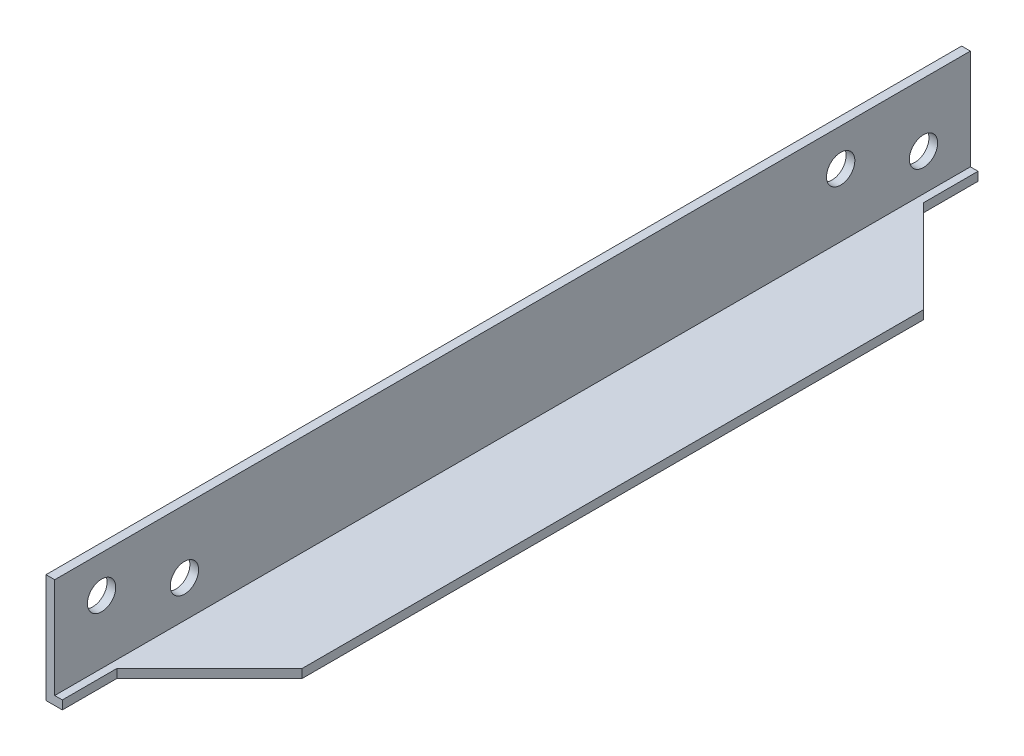
ISO-10303-21;
HEADER;
FILE_DESCRIPTION(('STEP AP214'),'2;1');
FILE_NAME('part.step','',(''),(''),'','','');
FILE_SCHEMA(('AUTOMOTIVE_DESIGN { 1 0 10303 214 1 1 1 1 }'));
ENDSEC;
DATA;
#1=APPLICATION_CONTEXT('core data for automotive mechanical design processes');
#2=APPLICATION_PROTOCOL_DEFINITION('international standard','automotive_design',2000,#1);
#3=PRODUCT_CONTEXT('',#1,'mechanical');
#4=PRODUCT('Part','Part','',(#3));
#5=PRODUCT_RELATED_PRODUCT_CATEGORY('part','',(#4));
#6=PRODUCT_DEFINITION_FORMATION('','',#4);
#7=PRODUCT_DEFINITION_CONTEXT('part definition',#1,'design');
#8=PRODUCT_DEFINITION('design','',#6,#7);
#9=PRODUCT_DEFINITION_SHAPE('','',#8);
#10=(LENGTH_UNIT() NAMED_UNIT(*) SI_UNIT(.MILLI.,.METRE.));
#11=(NAMED_UNIT(*) PLANE_ANGLE_UNIT() SI_UNIT($,.RADIAN.));
#12=(NAMED_UNIT(*) SI_UNIT($,.STERADIAN.) SOLID_ANGLE_UNIT());
#13=UNCERTAINTY_MEASURE_WITH_UNIT(LENGTH_MEASURE(1.E-05),#10,'distance_accuracy_value','');
#14=(GEOMETRIC_REPRESENTATION_CONTEXT(3) GLOBAL_UNCERTAINTY_ASSIGNED_CONTEXT((#13)) GLOBAL_UNIT_ASSIGNED_CONTEXT((#10,
#11,#12)) REPRESENTATION_CONTEXT('',''));
#15=CARTESIAN_POINT('',(0.,0.,0.));
#16=DIRECTION('',(0.,0.,1.));
#17=DIRECTION('',(1.,0.,0.));
#18=AXIS2_PLACEMENT_3D('',#15,#16,#17);
#19=CARTESIAN_POINT('',(0.,0.,840.));
#20=DIRECTION('',(1.,0.,0.));
#21=DIRECTION('',(0.,0.,-1.));
#22=AXIS2_PLACEMENT_3D('',#19,#20,#21);
#23=PLANE('',#22);
#24=CARTESIAN_POINT('',(0.,42.,721.));
#25=DIRECTION('',(-1.,0.,0.));
#26=DIRECTION('',(0.,0.,1.));
#27=AXIS2_PLACEMENT_3D('',#24,#25,#26);
#28=CIRCLE('',#27,13.);
#29=CARTESIAN_POINT('',(0.,42.,734.));
#30=VERTEX_POINT('',#29);
#31=EDGE_CURVE('E162',#30,#30,#28,.T.);
#32=ORIENTED_EDGE('',*,*,#31,.F.);
#33=EDGE_LOOP('',(#32));
#34=FACE_BOUND('',#33,.T.);
#35=CARTESIAN_POINT('',(0.,66.,797.));
#36=DIRECTION('',(-1.,0.,0.));
#37=DIRECTION('',(0.,0.,1.));
#38=AXIS2_PLACEMENT_3D('',#35,#36,#37);
#39=CIRCLE('',#38,13.);
#40=CARTESIAN_POINT('',(0.,66.,810.));
#41=VERTEX_POINT('',#40);
#42=EDGE_CURVE('E152',#41,#41,#39,.T.);
#43=ORIENTED_EDGE('',*,*,#42,.F.);
#44=EDGE_LOOP('',(#43));
#45=FACE_BOUND('',#44,.T.);
#46=CARTESIAN_POINT('',(0.,66.,119.));
#47=DIRECTION('',(-1.,0.,0.));
#48=DIRECTION('',(0.,0.,1.));
#49=AXIS2_PLACEMENT_3D('',#46,#47,#48);
#50=CIRCLE('',#49,13.);
#51=CARTESIAN_POINT('',(0.,66.,132.));
#52=VERTEX_POINT('',#51);
#53=EDGE_CURVE('E149',#52,#52,#50,.T.);
#54=ORIENTED_EDGE('',*,*,#53,.F.);
#55=EDGE_LOOP('',(#54));
#56=FACE_BOUND('',#55,.T.);
#57=CARTESIAN_POINT('',(0.,42.,43.));
#58=DIRECTION('',(-1.,0.,0.));
#59=DIRECTION('',(0.,0.,1.));
#60=AXIS2_PLACEMENT_3D('',#57,#58,#59);
#61=CIRCLE('',#60,13.);
#62=CARTESIAN_POINT('',(0.,42.,56.));
#63=VERTEX_POINT('',#62);
#64=EDGE_CURVE('E146',#63,#63,#61,.T.);
#65=ORIENTED_EDGE('',*,*,#64,.F.);
#66=EDGE_LOOP('',(#65));
#67=FACE_BOUND('',#66,.T.);
#68=DIRECTION('',(0.,-1.,0.));
#69=VECTOR('',#68,1.);
#70=CARTESIAN_POINT('',(0.,0.,0.));
#71=LINE('',#70,#69);
#72=CARTESIAN_POINT('',(0.,100.,0.));
#73=VERTEX_POINT('',#72);
#74=CARTESIAN_POINT('',(0.,0.,0.));
#75=VERTEX_POINT('',#74);
#76=EDGE_CURVE('E181',#73,#75,#71,.T.);
#77=ORIENTED_EDGE('',*,*,#76,.T.);
#78=DIRECTION('',(0.,0.,-1.));
#79=VECTOR('',#78,1.);
#80=CARTESIAN_POINT('',(0.,0.,840.));
#81=LINE('',#80,#79);
#82=CARTESIAN_POINT('',(0.,0.,840.));
#83=VERTEX_POINT('',#82);
#84=EDGE_CURVE('E11',#83,#75,#81,.T.);
#85=ORIENTED_EDGE('',*,*,#84,.F.);
#86=DIRECTION('',(0.,-1.,0.));
#87=VECTOR('',#86,1.);
#88=CARTESIAN_POINT('',(0.,0.,840.));
#89=LINE('',#88,#87);
#90=CARTESIAN_POINT('',(0.,100.,840.));
#91=VERTEX_POINT('',#90);
#92=EDGE_CURVE('E185',#91,#83,#89,.T.);
#93=ORIENTED_EDGE('',*,*,#92,.F.);
#94=DIRECTION('',(0.,0.,-1.));
#95=VECTOR('',#94,1.);
#96=CARTESIAN_POINT('',(0.,100.,840.));
#97=LINE('',#96,#95);
#98=EDGE_CURVE('E135',#91,#73,#97,.T.);
#99=ORIENTED_EDGE('',*,*,#98,.T.);
#100=EDGE_LOOP('',(#77,#85,#93,#99));
#101=FACE_BOUND('',#100,.T.);
#102=ADVANCED_FACE('F34',(#34,#45,#56,#67,#101),#23,.F.);
#103=CARTESIAN_POINT('',(0.,0.,840.));
#104=DIRECTION('',(0.,1.,0.));
#105=DIRECTION('',(0.,0.,1.));
#106=AXIS2_PLACEMENT_3D('',#103,#104,#105);
#107=PLANE('',#106);
#108=DIRECTION('',(-0.707106781186549,0.,0.707106781186546));
#109=VECTOR('',#108,1.);
#110=CARTESIAN_POINT('',(15.,0.,790.));
#111=LINE('',#110,#109);
#112=CARTESIAN_POINT('',(100.,0.,705.));
#113=VERTEX_POINT('',#112);
#114=CARTESIAN_POINT('',(15.,0.,790.));
#115=VERTEX_POINT('',#114);
#116=EDGE_CURVE('E112',#113,#115,#111,.T.);
#117=ORIENTED_EDGE('',*,*,#116,.T.);
#118=DIRECTION('',(0.,0.,1.));
#119=VECTOR('',#118,1.);
#120=CARTESIAN_POINT('',(15.,0.,840.));
#121=LINE('',#120,#119);
#122=CARTESIAN_POINT('',(15.,0.,840.));
#123=VERTEX_POINT('',#122);
#124=EDGE_CURVE('E119',#115,#123,#121,.T.);
#125=ORIENTED_EDGE('',*,*,#124,.T.);
#126=DIRECTION('',(1.,0.,0.));
#127=VECTOR('',#126,1.);
#128=CARTESIAN_POINT('',(0.,0.,840.));
#129=LINE('',#128,#127);
#130=EDGE_CURVE('E188',#83,#123,#129,.T.);
#131=ORIENTED_EDGE('',*,*,#130,.F.);
#132=ORIENTED_EDGE('',*,*,#84,.T.);
#133=DIRECTION('',(1.,0.,0.));
#134=VECTOR('',#133,1.);
#135=CARTESIAN_POINT('',(0.,0.,0.));
#136=LINE('',#135,#134);
#137=CARTESIAN_POINT('',(15.,0.,0.));
#138=VERTEX_POINT('',#137);
#139=EDGE_CURVE('E195',#75,#138,#136,.T.);
#140=ORIENTED_EDGE('',*,*,#139,.T.);
#141=DIRECTION('',(0.,0.,1.));
#142=VECTOR('',#141,1.);
#143=CARTESIAN_POINT('',(15.,0.,0.));
#144=LINE('',#143,#142);
#145=CARTESIAN_POINT('',(15.,0.,50.));
#146=VERTEX_POINT('',#145);
#147=EDGE_CURVE('E224',#138,#146,#144,.T.);
#148=ORIENTED_EDGE('',*,*,#147,.T.);
#149=DIRECTION('',(0.707106781186549,0.,0.707106781186546));
#150=VECTOR('',#149,1.);
#151=CARTESIAN_POINT('',(15.,0.,50.));
#152=LINE('',#151,#150);
#153=CARTESIAN_POINT('',(100.,0.,135.));
#154=VERTEX_POINT('',#153);
#155=EDGE_CURVE('E134',#146,#154,#152,.T.);
#156=ORIENTED_EDGE('',*,*,#155,.T.);
#157=DIRECTION('',(0.,0.,-1.));
#158=VECTOR('',#157,1.);
#159=CARTESIAN_POINT('',(100.,0.,840.));
#160=LINE('',#159,#158);
#161=EDGE_CURVE('E42',#113,#154,#160,.T.);
#162=ORIENTED_EDGE('',*,*,#161,.F.);
#163=EDGE_LOOP('',(#117,#125,#131,#132,#140,#148,#156,#162));
#164=FACE_BOUND('',#163,.T.);
#165=ADVANCED_FACE('F131',(#164),#107,.F.);
#166=CARTESIAN_POINT('',(100.,0.,840.));
#167=DIRECTION('',(-1.,0.,0.));
#168=DIRECTION('',(0.,0.,1.));
#169=AXIS2_PLACEMENT_3D('',#166,#167,#168);
#170=PLANE('',#169);
#171=DIRECTION('',(0.,0.,1.));
#172=VECTOR('',#171,1.);
#173=CARTESIAN_POINT('',(100.,8.00000000000001,0.));
#174=LINE('',#173,#172);
#175=CARTESIAN_POINT('',(100.,8.00000000000001,135.));
#176=VERTEX_POINT('',#175);
#177=CARTESIAN_POINT('',(100.,8.00000000000001,705.));
#178=VERTEX_POINT('',#177);
#179=EDGE_CURVE('E128',#176,#178,#174,.T.);
#180=ORIENTED_EDGE('',*,*,#179,.T.);
#181=DIRECTION('',(0.,1.,0.));
#182=VECTOR('',#181,1.);
#183=CARTESIAN_POINT('',(100.,0.,705.));
#184=LINE('',#183,#182);
#185=EDGE_CURVE('E50',#113,#178,#184,.T.);
#186=ORIENTED_EDGE('',*,*,#185,.F.);
#187=ORIENTED_EDGE('',*,*,#161,.T.);
#188=DIRECTION('',(0.,1.,0.));
#189=VECTOR('',#188,1.);
#190=CARTESIAN_POINT('',(100.,0.,135.));
#191=LINE('',#190,#189);
#192=EDGE_CURVE('E230',#154,#176,#191,.T.);
#193=ORIENTED_EDGE('',*,*,#192,.T.);
#194=EDGE_LOOP('',(#180,#186,#187,#193));
#195=FACE_BOUND('',#194,.T.);
#196=ADVANCED_FACE('F124',(#195),#170,.F.);
#197=CARTESIAN_POINT('',(0.,100.,840.));
#198=DIRECTION('',(0.,-1.,0.));
#199=DIRECTION('',(0.,0.,-1.));
#200=AXIS2_PLACEMENT_3D('',#197,#198,#199);
#201=PLANE('',#200);
#202=DIRECTION('',(-1.,0.,0.));
#203=VECTOR('',#202,1.);
#204=CARTESIAN_POINT('',(0.,100.,840.));
#205=LINE('',#204,#203);
#206=CARTESIAN_POINT('',(8.00000000000001,100.,840.));
#207=VERTEX_POINT('',#206);
#208=EDGE_CURVE('E138',#207,#91,#205,.T.);
#209=ORIENTED_EDGE('',*,*,#208,.F.);
#210=DIRECTION('',(0.,0.,1.));
#211=VECTOR('',#210,1.);
#212=CARTESIAN_POINT('',(8.00000000000001,100.,0.));
#213=LINE('',#212,#211);
#214=CARTESIAN_POINT('',(8.00000000000001,100.,0.));
#215=VERTEX_POINT('',#214);
#216=EDGE_CURVE('E175',#215,#207,#213,.T.);
#217=ORIENTED_EDGE('',*,*,#216,.F.);
#218=DIRECTION('',(-1.,0.,0.));
#219=VECTOR('',#218,1.);
#220=CARTESIAN_POINT('',(0.,100.,0.));
#221=LINE('',#220,#219);
#222=EDGE_CURVE('E189',#215,#73,#221,.T.);
#223=ORIENTED_EDGE('',*,*,#222,.T.);
#224=ORIENTED_EDGE('',*,*,#98,.F.);
#225=EDGE_LOOP('',(#209,#217,#223,#224));
#226=FACE_BOUND('',#225,.T.);
#227=ADVANCED_FACE('F202',(#226),#201,.F.);
#228=CARTESIAN_POINT('',(0.,0.,840.));
#229=DIRECTION('',(0.,0.,-1.));
#230=DIRECTION('',(-1.,0.,0.));
#231=AXIS2_PLACEMENT_3D('',#228,#229,#230);
#232=PLANE('',#231);
#233=ORIENTED_EDGE('',*,*,#130,.T.);
#234=DIRECTION('',(0.,1.,0.));
#235=VECTOR('',#234,1.);
#236=CARTESIAN_POINT('',(15.,0.,840.));
#237=LINE('',#236,#235);
#238=CARTESIAN_POINT('',(15.,7.99999999999999,840.));
#239=VERTEX_POINT('',#238);
#240=EDGE_CURVE('E222',#123,#239,#237,.T.);
#241=ORIENTED_EDGE('',*,*,#240,.T.);
#242=DIRECTION('',(1.,0.,0.));
#243=VECTOR('',#242,1.);
#244=CARTESIAN_POINT('',(100.,8.00000000000001,840.));
#245=LINE('',#244,#243);
#246=CARTESIAN_POINT('',(8.00000000000002,7.99999999999999,840.));
#247=VERTEX_POINT('',#246);
#248=EDGE_CURVE('E172',#247,#239,#245,.T.);
#249=ORIENTED_EDGE('',*,*,#248,.F.);
#250=DIRECTION('',(0.,-1.,0.));
#251=VECTOR('',#250,1.);
#252=CARTESIAN_POINT('',(8.00000000000001,100.,840.));
#253=LINE('',#252,#251);
#254=EDGE_CURVE('E145',#207,#247,#253,.T.);
#255=ORIENTED_EDGE('',*,*,#254,.F.);
#256=ORIENTED_EDGE('',*,*,#208,.T.);
#257=ORIENTED_EDGE('',*,*,#92,.T.);
#258=EDGE_LOOP('',(#233,#241,#249,#255,#256,#257));
#259=FACE_BOUND('',#258,.T.);
#260=ADVANCED_FACE('F211',(#259),#232,.F.);
#261=CARTESIAN_POINT('',(0.,0.,0.));
#262=DIRECTION('',(0.,0.,-1.));
#263=DIRECTION('',(-1.,0.,0.));
#264=AXIS2_PLACEMENT_3D('',#261,#262,#263);
#265=PLANE('',#264);
#266=DIRECTION('',(0.,1.,0.));
#267=VECTOR('',#266,1.);
#268=CARTESIAN_POINT('',(15.,0.,0.));
#269=LINE('',#268,#267);
#270=CARTESIAN_POINT('',(15.,7.99999999999999,0.));
#271=VERTEX_POINT('',#270);
#272=EDGE_CURVE('E58',#138,#271,#269,.T.);
#273=ORIENTED_EDGE('',*,*,#272,.F.);
#274=ORIENTED_EDGE('',*,*,#139,.F.);
#275=ORIENTED_EDGE('',*,*,#76,.F.);
#276=ORIENTED_EDGE('',*,*,#222,.F.);
#277=DIRECTION('',(0.,-1.,0.));
#278=VECTOR('',#277,1.);
#279=CARTESIAN_POINT('',(8.00000000000001,100.,0.));
#280=LINE('',#279,#278);
#281=CARTESIAN_POINT('',(8.00000000000002,7.99999999999999,0.));
#282=VERTEX_POINT('',#281);
#283=EDGE_CURVE('E168',#215,#282,#280,.T.);
#284=ORIENTED_EDGE('',*,*,#283,.T.);
#285=DIRECTION('',(1.,0.,0.));
#286=VECTOR('',#285,1.);
#287=CARTESIAN_POINT('',(100.,8.00000000000001,0.));
#288=LINE('',#287,#286);
#289=EDGE_CURVE('E171',#282,#271,#288,.T.);
#290=ORIENTED_EDGE('',*,*,#289,.T.);
#291=EDGE_LOOP('',(#273,#274,#275,#276,#284,#290));
#292=FACE_BOUND('',#291,.T.);
#293=ADVANCED_FACE('F208',(#292),#265,.T.);
#294=CARTESIAN_POINT('',(100.,8.00000000000001,0.));
#295=DIRECTION('',(0.,-1.,0.));
#296=DIRECTION('',(1.,0.,0.));
#297=AXIS2_PLACEMENT_3D('',#294,#295,#296);
#298=PLANE('',#297);
#299=ORIENTED_EDGE('',*,*,#248,.T.);
#300=DIRECTION('',(0.,0.,1.));
#301=VECTOR('',#300,1.);
#302=CARTESIAN_POINT('',(15.,7.99999999999999,840.));
#303=LINE('',#302,#301);
#304=CARTESIAN_POINT('',(15.,7.99999999999999,790.));
#305=VERTEX_POINT('',#304);
#306=EDGE_CURVE('E120',#305,#239,#303,.T.);
#307=ORIENTED_EDGE('',*,*,#306,.F.);
#308=DIRECTION('',(-0.707106781186549,0.,0.707106781186546));
#309=VECTOR('',#308,1.);
#310=CARTESIAN_POINT('',(15.,7.99999999999999,790.));
#311=LINE('',#310,#309);
#312=EDGE_CURVE('E236',#178,#305,#311,.T.);
#313=ORIENTED_EDGE('',*,*,#312,.F.);
#314=ORIENTED_EDGE('',*,*,#179,.F.);
#315=DIRECTION('',(0.707106781186549,0.,0.707106781186546));
#316=VECTOR('',#315,1.);
#317=CARTESIAN_POINT('',(15.,7.99999999999999,50.));
#318=LINE('',#317,#316);
#319=CARTESIAN_POINT('',(15.,7.99999999999999,50.));
#320=VERTEX_POINT('',#319);
#321=EDGE_CURVE('E221',#320,#176,#318,.T.);
#322=ORIENTED_EDGE('',*,*,#321,.F.);
#323=DIRECTION('',(0.,0.,1.));
#324=VECTOR('',#323,1.);
#325=CARTESIAN_POINT('',(15.,7.99999999999999,0.));
#326=LINE('',#325,#324);
#327=EDGE_CURVE('E220',#271,#320,#326,.T.);
#328=ORIENTED_EDGE('',*,*,#327,.F.);
#329=ORIENTED_EDGE('',*,*,#289,.F.);
#330=DIRECTION('',(0.,0.,1.));
#331=VECTOR('',#330,1.);
#332=CARTESIAN_POINT('',(8.00000000000002,7.99999999999999,0.));
#333=LINE('',#332,#331);
#334=EDGE_CURVE('E182',#282,#247,#333,.T.);
#335=ORIENTED_EDGE('',*,*,#334,.T.);
#336=EDGE_LOOP('',(#299,#307,#313,#314,#322,#328,#329,#335));
#337=FACE_BOUND('',#336,.T.);
#338=ADVANCED_FACE('F218',(#337),#298,.F.);
#339=CARTESIAN_POINT('',(8.00000000000001,100.,0.));
#340=DIRECTION('',(-1.,0.,0.));
#341=DIRECTION('',(0.,-1.,0.));
#342=AXIS2_PLACEMENT_3D('',#339,#340,#341);
#343=PLANE('',#342);
#344=CARTESIAN_POINT('',(8.00000000000002,42.,721.));
#345=DIRECTION('',(-1.,0.,0.));
#346=DIRECTION('',(0.,-1.,0.));
#347=AXIS2_PLACEMENT_3D('',#344,#345,#346);
#348=CIRCLE('',#347,13.);
#349=CARTESIAN_POINT('',(8.00000000000002,29.,721.));
#350=VERTEX_POINT('',#349);
#351=EDGE_CURVE('E37',#350,#350,#348,.T.);
#352=ORIENTED_EDGE('',*,*,#351,.T.);
#353=EDGE_LOOP('',(#352));
#354=FACE_BOUND('',#353,.T.);
#355=CARTESIAN_POINT('',(8.00000000000001,66.,797.));
#356=DIRECTION('',(-1.,0.,0.));
#357=DIRECTION('',(0.,-1.,0.));
#358=AXIS2_PLACEMENT_3D('',#355,#356,#357);
#359=CIRCLE('',#358,13.);
#360=CARTESIAN_POINT('',(8.00000000000001,53.,797.));
#361=VERTEX_POINT('',#360);
#362=EDGE_CURVE('E150',#361,#361,#359,.T.);
#363=ORIENTED_EDGE('',*,*,#362,.T.);
#364=EDGE_LOOP('',(#363));
#365=FACE_BOUND('',#364,.T.);
#366=CARTESIAN_POINT('',(8.00000000000001,66.,119.));
#367=DIRECTION('',(-1.,0.,0.));
#368=DIRECTION('',(0.,-1.,0.));
#369=AXIS2_PLACEMENT_3D('',#366,#367,#368);
#370=CIRCLE('',#369,13.);
#371=CARTESIAN_POINT('',(8.00000000000001,53.,119.));
#372=VERTEX_POINT('',#371);
#373=EDGE_CURVE('E147',#372,#372,#370,.T.);
#374=ORIENTED_EDGE('',*,*,#373,.T.);
#375=EDGE_LOOP('',(#374));
#376=FACE_BOUND('',#375,.T.);
#377=CARTESIAN_POINT('',(8.00000000000002,42.,43.));
#378=DIRECTION('',(-1.,0.,0.));
#379=DIRECTION('',(0.,-1.,0.));
#380=AXIS2_PLACEMENT_3D('',#377,#378,#379);
#381=CIRCLE('',#380,13.);
#382=CARTESIAN_POINT('',(8.00000000000002,29.,43.));
#383=VERTEX_POINT('',#382);
#384=EDGE_CURVE('E142',#383,#383,#381,.T.);
#385=ORIENTED_EDGE('',*,*,#384,.T.);
#386=EDGE_LOOP('',(#385));
#387=FACE_BOUND('',#386,.T.);
#388=ORIENTED_EDGE('',*,*,#254,.T.);
#389=ORIENTED_EDGE('',*,*,#334,.F.);
#390=ORIENTED_EDGE('',*,*,#283,.F.);
#391=ORIENTED_EDGE('',*,*,#216,.T.);
#392=EDGE_LOOP('',(#388,#389,#390,#391));
#393=FACE_BOUND('',#392,.T.);
#394=ADVANCED_FACE('F216',(#354,#365,#376,#387,#393),#343,.F.);
#395=CARTESIAN_POINT('',(100.,42.,43.));
#396=DIRECTION('',(-1.,0.,0.));
#397=DIRECTION('',(0.,0.,1.));
#398=AXIS2_PLACEMENT_3D('',#395,#396,#397);
#399=CYLINDRICAL_SURFACE('',#398,13.);
#400=ORIENTED_EDGE('',*,*,#64,.T.);
#401=EDGE_LOOP('',(#400));
#402=FACE_BOUND('',#401,.T.);
#403=ORIENTED_EDGE('',*,*,#384,.F.);
#404=EDGE_LOOP('',(#403));
#405=FACE_BOUND('',#404,.T.);
#406=ADVANCED_FACE('F264',(#402,#405),#399,.F.);
#407=CARTESIAN_POINT('',(100.,66.,119.));
#408=DIRECTION('',(-1.,0.,0.));
#409=DIRECTION('',(0.,0.,1.));
#410=AXIS2_PLACEMENT_3D('',#407,#408,#409);
#411=CYLINDRICAL_SURFACE('',#410,13.);
#412=ORIENTED_EDGE('',*,*,#53,.T.);
#413=EDGE_LOOP('',(#412));
#414=FACE_BOUND('',#413,.T.);
#415=ORIENTED_EDGE('',*,*,#373,.F.);
#416=EDGE_LOOP('',(#415));
#417=FACE_BOUND('',#416,.T.);
#418=ADVANCED_FACE('F267',(#414,#417),#411,.F.);
#419=CARTESIAN_POINT('',(100.,66.,797.));
#420=DIRECTION('',(-1.,0.,0.));
#421=DIRECTION('',(0.,0.,1.));
#422=AXIS2_PLACEMENT_3D('',#419,#420,#421);
#423=CYLINDRICAL_SURFACE('',#422,13.);
#424=ORIENTED_EDGE('',*,*,#42,.T.);
#425=EDGE_LOOP('',(#424));
#426=FACE_BOUND('',#425,.T.);
#427=ORIENTED_EDGE('',*,*,#362,.F.);
#428=EDGE_LOOP('',(#427));
#429=FACE_BOUND('',#428,.T.);
#430=ADVANCED_FACE('F342',(#426,#429),#423,.F.);
#431=CARTESIAN_POINT('',(100.,42.,721.));
#432=DIRECTION('',(-1.,0.,0.));
#433=DIRECTION('',(0.,0.,1.));
#434=AXIS2_PLACEMENT_3D('',#431,#432,#433);
#435=CYLINDRICAL_SURFACE('',#434,13.);
#436=ORIENTED_EDGE('',*,*,#31,.T.);
#437=EDGE_LOOP('',(#436));
#438=FACE_BOUND('',#437,.T.);
#439=ORIENTED_EDGE('',*,*,#351,.F.);
#440=EDGE_LOOP('',(#439));
#441=FACE_BOUND('',#440,.T.);
#442=ADVANCED_FACE('F316',(#438,#441),#435,.F.);
#443=CARTESIAN_POINT('',(15.,0.,50.));
#444=DIRECTION('',(-0.707106781186546,0.,0.707106781186549));
#445=DIRECTION('',(0.707106781186549,0.,0.707106781186546));
#446=AXIS2_PLACEMENT_3D('',#443,#444,#445);
#447=PLANE('',#446);
#448=ORIENTED_EDGE('',*,*,#321,.T.);
#449=ORIENTED_EDGE('',*,*,#192,.F.);
#450=ORIENTED_EDGE('',*,*,#155,.F.);
#451=DIRECTION('',(0.,1.,0.));
#452=VECTOR('',#451,1.);
#453=CARTESIAN_POINT('',(15.,0.,50.));
#454=LINE('',#453,#452);
#455=EDGE_CURVE('E232',#146,#320,#454,.T.);
#456=ORIENTED_EDGE('',*,*,#455,.T.);
#457=EDGE_LOOP('',(#448,#449,#450,#456));
#458=FACE_BOUND('',#457,.T.);
#459=ADVANCED_FACE('F249',(#458),#447,.F.);
#460=CARTESIAN_POINT('',(15.,0.,0.));
#461=DIRECTION('',(-1.,0.,0.));
#462=DIRECTION('',(0.,-1.,0.));
#463=AXIS2_PLACEMENT_3D('',#460,#461,#462);
#464=PLANE('',#463);
#465=ORIENTED_EDGE('',*,*,#327,.T.);
#466=ORIENTED_EDGE('',*,*,#455,.F.);
#467=ORIENTED_EDGE('',*,*,#147,.F.);
#468=ORIENTED_EDGE('',*,*,#272,.T.);
#469=EDGE_LOOP('',(#465,#466,#467,#468));
#470=FACE_BOUND('',#469,.T.);
#471=ADVANCED_FACE('F242',(#470),#464,.F.);
#472=CARTESIAN_POINT('',(15.,0.,840.));
#473=DIRECTION('',(-1.,0.,0.));
#474=DIRECTION('',(0.,-1.,0.));
#475=AXIS2_PLACEMENT_3D('',#472,#473,#474);
#476=PLANE('',#475);
#477=ORIENTED_EDGE('',*,*,#306,.T.);
#478=ORIENTED_EDGE('',*,*,#240,.F.);
#479=ORIENTED_EDGE('',*,*,#124,.F.);
#480=DIRECTION('',(0.,1.,0.));
#481=VECTOR('',#480,1.);
#482=CARTESIAN_POINT('',(15.,0.,790.));
#483=LINE('',#482,#481);
#484=EDGE_CURVE('E114',#115,#305,#483,.T.);
#485=ORIENTED_EDGE('',*,*,#484,.T.);
#486=EDGE_LOOP('',(#477,#478,#479,#485));
#487=FACE_BOUND('',#486,.T.);
#488=ADVANCED_FACE('F240',(#487),#476,.F.);
#489=CARTESIAN_POINT('',(15.,0.,790.));
#490=DIRECTION('',(-0.707106781186546,0.,-0.707106781186549));
#491=DIRECTION('',(-0.707106781186549,0.,0.707106781186546));
#492=AXIS2_PLACEMENT_3D('',#489,#490,#491);
#493=PLANE('',#492);
#494=ORIENTED_EDGE('',*,*,#312,.T.);
#495=ORIENTED_EDGE('',*,*,#484,.F.);
#496=ORIENTED_EDGE('',*,*,#116,.F.);
#497=ORIENTED_EDGE('',*,*,#185,.T.);
#498=EDGE_LOOP('',(#494,#495,#496,#497));
#499=FACE_BOUND('',#498,.T.);
#500=ADVANCED_FACE('F113',(#499),#493,.F.);
#501=CLOSED_SHELL('',(#102,#165,#196,#227,#260,#293,#338,#394,#406,#418,#430,#442,#459,#471,
#488,#500));
#502=MANIFOLD_SOLID_BREP('B2',#501);
#503=ADVANCED_BREP_SHAPE_REPRESENTATION('',(#18,#502),#14);
#504=SHAPE_DEFINITION_REPRESENTATION(#9,#503);
ENDSEC;
END-ISO-10303-21;
